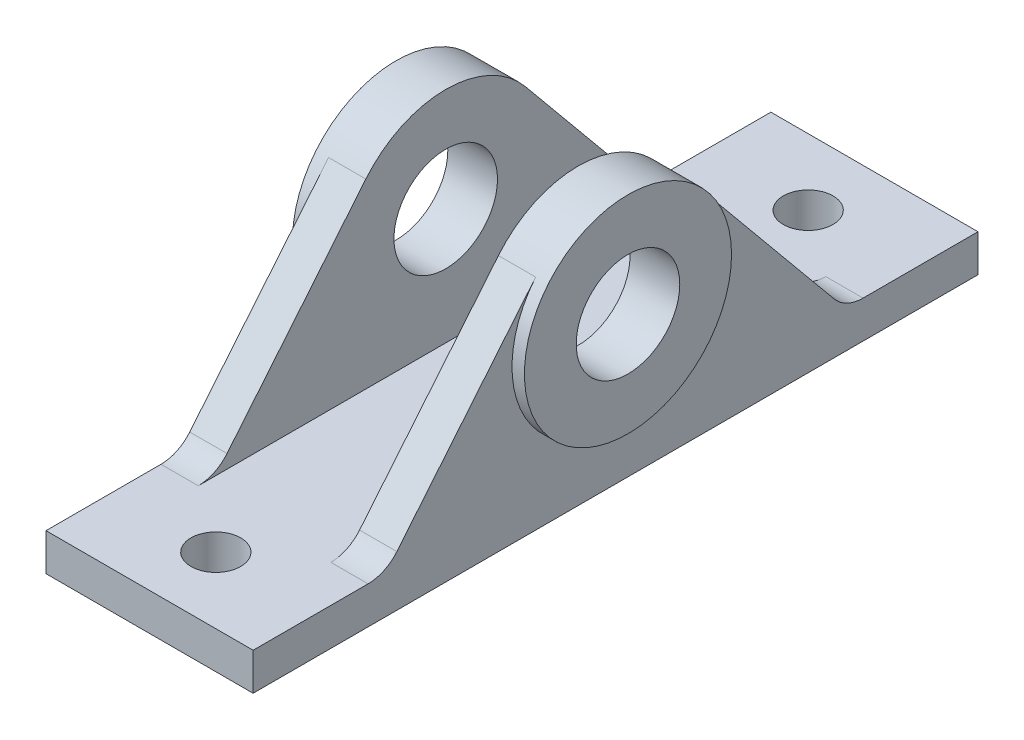
ISO-10303-21;
HEADER;
FILE_DESCRIPTION(('STEP AP214'),'2;1');
FILE_NAME('part.step','',(''),(''),'','','');
FILE_SCHEMA(('AUTOMOTIVE_DESIGN { 1 0 10303 214 1 1 1 1 }'));
ENDSEC;
DATA;
#1=APPLICATION_CONTEXT('core data for automotive mechanical design processes');
#2=APPLICATION_PROTOCOL_DEFINITION('international standard','automotive_design',2000,#1);
#3=PRODUCT_CONTEXT('',#1,'mechanical');
#4=PRODUCT('Part','Part','',(#3));
#5=PRODUCT_RELATED_PRODUCT_CATEGORY('part','',(#4));
#6=PRODUCT_DEFINITION_FORMATION('','',#4);
#7=PRODUCT_DEFINITION_CONTEXT('part definition',#1,'design');
#8=PRODUCT_DEFINITION('design','',#6,#7);
#9=PRODUCT_DEFINITION_SHAPE('','',#8);
#10=(LENGTH_UNIT() NAMED_UNIT(*) SI_UNIT(.MILLI.,.METRE.));
#11=(NAMED_UNIT(*) PLANE_ANGLE_UNIT() SI_UNIT($,.RADIAN.));
#12=(NAMED_UNIT(*) SI_UNIT($,.STERADIAN.) SOLID_ANGLE_UNIT());
#13=UNCERTAINTY_MEASURE_WITH_UNIT(LENGTH_MEASURE(1.E-05),#10,'distance_accuracy_value','');
#14=(GEOMETRIC_REPRESENTATION_CONTEXT(3) GLOBAL_UNCERTAINTY_ASSIGNED_CONTEXT((#13)) GLOBAL_UNIT_ASSIGNED_CONTEXT((#10,
#11,#12)) REPRESENTATION_CONTEXT('',''));
#15=CARTESIAN_POINT('',(0.,0.,0.));
#16=DIRECTION('',(0.,0.,1.));
#17=DIRECTION('',(1.,0.,0.));
#18=AXIS2_PLACEMENT_3D('',#15,#16,#17);
#19=CARTESIAN_POINT('',(0.,9.,0.));
#20=DIRECTION('',(0.,-1.,0.));
#21=DIRECTION('',(0.,0.,-1.));
#22=AXIS2_PLACEMENT_3D('',#19,#20,#21);
#23=PLANE('',#22);
#24=CARTESIAN_POINT('',(0.,9.,-71.5));
#25=DIRECTION('',(0.,-1.,0.));
#26=DIRECTION('',(0.,0.,-1.));
#27=AXIS2_PLACEMENT_3D('',#24,#25,#26);
#28=CIRCLE('',#27,6.);
#29=CARTESIAN_POINT('',(0.,9.,-77.5));
#30=VERTEX_POINT('',#29);
#31=EDGE_CURVE('E245',#30,#30,#28,.T.);
#32=ORIENTED_EDGE('',*,*,#31,.T.);
#33=EDGE_LOOP('',(#32));
#34=FACE_BOUND('',#33,.T.);
#35=CARTESIAN_POINT('',(0.,9.,71.5));
#36=DIRECTION('',(0.,1.,0.));
#37=DIRECTION('',(0.,0.,1.));
#38=AXIS2_PLACEMENT_3D('',#35,#36,#37);
#39=CIRCLE('',#38,6.);
#40=CARTESIAN_POINT('',(0.,9.,77.5));
#41=VERTEX_POINT('',#40);
#42=EDGE_CURVE('E253',#41,#41,#39,.T.);
#43=ORIENTED_EDGE('',*,*,#42,.F.);
#44=EDGE_LOOP('',(#43));
#45=FACE_BOUND('',#44,.T.);
#46=DIRECTION('',(0.,0.,1.));
#47=VECTOR('',#46,1.);
#48=CARTESIAN_POINT('',(-25.,9.,87.5));
#49=LINE('',#48,#47);
#50=CARTESIAN_POINT('',(-25.,9.,-87.5));
#51=VERTEX_POINT('',#50);
#52=CARTESIAN_POINT('',(-25.,9.,-59.7432282698204));
#53=VERTEX_POINT('',#52);
#54=EDGE_CURVE('E274',#51,#53,#49,.T.);
#55=ORIENTED_EDGE('',*,*,#54,.T.);
#56=DIRECTION('',(-1.,0.,0.));
#57=VECTOR('',#56,1.);
#58=CARTESIAN_POINT('',(-16.,9.,-59.7432282698204));
#59=LINE('',#58,#57);
#60=CARTESIAN_POINT('',(-16.,9.,-59.7432282698204));
#61=VERTEX_POINT('',#60);
#62=EDGE_CURVE('E344',#53,#61,#59,.F.);
#63=ORIENTED_EDGE('',*,*,#62,.T.);
#64=DIRECTION('',(0.,0.,1.));
#65=VECTOR('',#64,1.);
#66=CARTESIAN_POINT('',(-16.,9.,0.));
#67=LINE('',#66,#65);
#68=CARTESIAN_POINT('',(-16.,9.,59.7432282698204));
#69=VERTEX_POINT('',#68);
#70=EDGE_CURVE('E195',#61,#69,#67,.T.);
#71=ORIENTED_EDGE('',*,*,#70,.T.);
#72=DIRECTION('',(-1.,0.,0.));
#73=VECTOR('',#72,1.);
#74=CARTESIAN_POINT('',(0.,9.,59.7432282698204));
#75=LINE('',#74,#73);
#76=CARTESIAN_POINT('',(-25.,9.,59.7432282698204));
#77=VERTEX_POINT('',#76);
#78=EDGE_CURVE('E340',#69,#77,#75,.T.);
#79=ORIENTED_EDGE('',*,*,#78,.T.);
#80=CARTESIAN_POINT('',(-25.,9.,87.5));
#81=VERTEX_POINT('',#80);
#82=EDGE_CURVE('E273',#77,#81,#49,.T.);
#83=ORIENTED_EDGE('',*,*,#82,.T.);
#84=DIRECTION('',(1.,0.,0.));
#85=VECTOR('',#84,1.);
#86=CARTESIAN_POINT('',(-25.,9.,87.5));
#87=LINE('',#86,#85);
#88=CARTESIAN_POINT('',(25.,9.,87.5));
#89=VERTEX_POINT('',#88);
#90=EDGE_CURVE('E278',#81,#89,#87,.T.);
#91=ORIENTED_EDGE('',*,*,#90,.T.);
#92=DIRECTION('',(0.,0.,-1.));
#93=VECTOR('',#92,1.);
#94=CARTESIAN_POINT('',(25.,9.,87.5));
#95=LINE('',#94,#93);
#96=CARTESIAN_POINT('',(25.,9.,59.7432282698204));
#97=VERTEX_POINT('',#96);
#98=EDGE_CURVE('E265',#89,#97,#95,.T.);
#99=ORIENTED_EDGE('',*,*,#98,.T.);
#100=DIRECTION('',(1.,0.,0.));
#101=VECTOR('',#100,1.);
#102=CARTESIAN_POINT('',(16.,9.,59.7432282698204));
#103=LINE('',#102,#101);
#104=CARTESIAN_POINT('',(16.,9.,59.7432282698204));
#105=VERTEX_POINT('',#104);
#106=EDGE_CURVE('E309',#97,#105,#103,.F.);
#107=ORIENTED_EDGE('',*,*,#106,.T.);
#108=DIRECTION('',(0.,0.,1.));
#109=VECTOR('',#108,1.);
#110=CARTESIAN_POINT('',(16.,9.,0.));
#111=LINE('',#110,#109);
#112=CARTESIAN_POINT('',(16.,9.,-59.7432282698204));
#113=VERTEX_POINT('',#112);
#114=EDGE_CURVE('E222',#113,#105,#111,.T.);
#115=ORIENTED_EDGE('',*,*,#114,.F.);
#116=DIRECTION('',(1.,0.,0.));
#117=VECTOR('',#116,1.);
#118=CARTESIAN_POINT('',(0.,9.,-59.7432282698204));
#119=LINE('',#118,#117);
#120=CARTESIAN_POINT('',(25.,9.,-59.7432282698204));
#121=VERTEX_POINT('',#120);
#122=EDGE_CURVE('E313',#113,#121,#119,.T.);
#123=ORIENTED_EDGE('',*,*,#122,.T.);
#124=CARTESIAN_POINT('',(25.,9.,-87.5));
#125=VERTEX_POINT('',#124);
#126=EDGE_CURVE('E270',#121,#125,#95,.T.);
#127=ORIENTED_EDGE('',*,*,#126,.T.);
#128=DIRECTION('',(-1.,0.,0.));
#129=VECTOR('',#128,1.);
#130=CARTESIAN_POINT('',(-25.,9.,-87.5));
#131=LINE('',#130,#129);
#132=EDGE_CURVE('E269',#125,#51,#131,.T.);
#133=ORIENTED_EDGE('',*,*,#132,.T.);
#134=EDGE_LOOP('',(#55,#63,#71,#79,#83,#91,#99,#107,#115,#123,#127,#133));
#135=FACE_BOUND('',#134,.T.);
#136=ADVANCED_FACE('F39',(#34,#45,#135),#23,.F.);
#137=CARTESIAN_POINT('',(25.,9.,87.5));
#138=DIRECTION('',(-1.,0.,0.));
#139=DIRECTION('',(0.,0.,1.));
#140=AXIS2_PLACEMENT_3D('',#137,#138,#139);
#141=PLANE('',#140);
#142=DIRECTION('',(0.,0.,-1.));
#143=VECTOR('',#142,1.);
#144=CARTESIAN_POINT('',(25.,0.,87.5));
#145=LINE('',#144,#143);
#146=CARTESIAN_POINT('',(25.,0.,87.5));
#147=VERTEX_POINT('',#146);
#148=CARTESIAN_POINT('',(25.,0.,-87.5));
#149=VERTEX_POINT('',#148);
#150=EDGE_CURVE('E261',#147,#149,#145,.T.);
#151=ORIENTED_EDGE('',*,*,#150,.T.);
#152=DIRECTION('',(0.,-1.,0.));
#153=VECTOR('',#152,1.);
#154=CARTESIAN_POINT('',(25.,9.,-87.5));
#155=LINE('',#154,#153);
#156=EDGE_CURVE('E305',#125,#149,#155,.T.);
#157=ORIENTED_EDGE('',*,*,#156,.F.);
#158=ORIENTED_EDGE('',*,*,#126,.F.);
#159=CARTESIAN_POINT('',(25.,18.,-59.7432282698204));
#160=DIRECTION('',(-1.,0.,0.));
#161=DIRECTION('',(0.,0.,1.));
#162=AXIS2_PLACEMENT_3D('',#159,#160,#161);
#163=CIRCLE('',#162,9.);
#164=CARTESIAN_POINT('',(25.,12.2734689766643,-52.8001135193087));
#165=VERTEX_POINT('',#164);
#166=EDGE_CURVE('E324',#121,#165,#163,.T.);
#167=ORIENTED_EDGE('',*,*,#166,.T.);
#168=DIRECTION('',(0.,0.771457194501302,0.636281224815081));
#169=VECTOR('',#168,1.);
#170=CARTESIAN_POINT('',(25.,30.8866211113077,-37.4483878210913));
#171=LINE('',#170,#169);
#172=CARTESIAN_POINT('',(25.,52.907030620377,-19.2864298625326));
#173=VERTEX_POINT('',#172);
#174=EDGE_CURVE('E221',#165,#173,#171,.T.);
#175=ORIENTED_EDGE('',*,*,#174,.T.);
#176=CARTESIAN_POINT('',(25.,37.,0.));
#177=DIRECTION('',(1.,0.,0.));
#178=DIRECTION('',(0.,0.,-1.));
#179=AXIS2_PLACEMENT_3D('',#176,#177,#178);
#180=CIRCLE('',#179,25.);
#181=CARTESIAN_POINT('',(25.,52.907030620377,19.2864298625326));
#182=VERTEX_POINT('',#181);
#183=EDGE_CURVE('E235',#182,#173,#180,.T.);
#184=ORIENTED_EDGE('',*,*,#183,.F.);
#185=DIRECTION('',(0.,0.771457194501302,-0.636281224815081));
#186=VECTOR('',#185,1.);
#187=CARTESIAN_POINT('',(25.,30.8866211113077,37.4483878210913));
#188=LINE('',#187,#186);
#189=CARTESIAN_POINT('',(25.,12.2734689766643,52.8001135193087));
#190=VERTEX_POINT('',#189);
#191=EDGE_CURVE('E226',#190,#182,#188,.T.);
#192=ORIENTED_EDGE('',*,*,#191,.F.);
#193=CARTESIAN_POINT('',(25.,18.,59.7432282698204));
#194=DIRECTION('',(-1.,0.,0.));
#195=DIRECTION('',(0.,0.,1.));
#196=AXIS2_PLACEMENT_3D('',#193,#194,#195);
#197=CIRCLE('',#196,9.);
#198=EDGE_CURVE('E331',#190,#97,#197,.T.);
#199=ORIENTED_EDGE('',*,*,#198,.T.);
#200=ORIENTED_EDGE('',*,*,#98,.F.);
#201=DIRECTION('',(0.,-1.,0.));
#202=VECTOR('',#201,1.);
#203=CARTESIAN_POINT('',(25.,9.,87.5));
#204=LINE('',#203,#202);
#205=EDGE_CURVE('E281',#89,#147,#204,.T.);
#206=ORIENTED_EDGE('',*,*,#205,.T.);
#207=EDGE_LOOP('',(#151,#157,#158,#167,#175,#184,#192,#199,#200,#206));
#208=FACE_BOUND('',#207,.T.);
#209=ADVANCED_FACE('F367',(#208),#141,.F.);
#210=CARTESIAN_POINT('',(-25.,9.,-87.5));
#211=DIRECTION('',(0.,0.,1.));
#212=DIRECTION('',(1.,0.,0.));
#213=AXIS2_PLACEMENT_3D('',#210,#211,#212);
#214=PLANE('',#213);
#215=DIRECTION('',(-1.,0.,0.));
#216=VECTOR('',#215,1.);
#217=CARTESIAN_POINT('',(-25.,0.,-87.5));
#218=LINE('',#217,#216);
#219=CARTESIAN_POINT('',(-25.,0.,-87.5));
#220=VERTEX_POINT('',#219);
#221=EDGE_CURVE('E285',#149,#220,#218,.T.);
#222=ORIENTED_EDGE('',*,*,#221,.T.);
#223=DIRECTION('',(0.,-1.,0.));
#224=VECTOR('',#223,1.);
#225=CARTESIAN_POINT('',(-25.,9.,-87.5));
#226=LINE('',#225,#224);
#227=EDGE_CURVE('E301',#51,#220,#226,.T.);
#228=ORIENTED_EDGE('',*,*,#227,.F.);
#229=ORIENTED_EDGE('',*,*,#132,.F.);
#230=ORIENTED_EDGE('',*,*,#156,.T.);
#231=EDGE_LOOP('',(#222,#228,#229,#230));
#232=FACE_BOUND('',#231,.T.);
#233=ADVANCED_FACE('F365',(#232),#214,.F.);
#234=CARTESIAN_POINT('',(-25.,9.,87.5));
#235=DIRECTION('',(1.,0.,0.));
#236=DIRECTION('',(0.,0.,-1.));
#237=AXIS2_PLACEMENT_3D('',#234,#235,#236);
#238=PLANE('',#237);
#239=DIRECTION('',(0.,0.,1.));
#240=VECTOR('',#239,1.);
#241=CARTESIAN_POINT('',(-25.,0.,87.5));
#242=LINE('',#241,#240);
#243=CARTESIAN_POINT('',(-25.,0.,87.5));
#244=VERTEX_POINT('',#243);
#245=EDGE_CURVE('E288',#220,#244,#242,.T.);
#246=ORIENTED_EDGE('',*,*,#245,.T.);
#247=DIRECTION('',(0.,-1.,0.));
#248=VECTOR('',#247,1.);
#249=CARTESIAN_POINT('',(-25.,9.,87.5));
#250=LINE('',#249,#248);
#251=EDGE_CURVE('E297',#81,#244,#250,.T.);
#252=ORIENTED_EDGE('',*,*,#251,.F.);
#253=ORIENTED_EDGE('',*,*,#82,.F.);
#254=CARTESIAN_POINT('',(-25.,18.,59.7432282698204));
#255=DIRECTION('',(1.,0.,0.));
#256=DIRECTION('',(0.,0.,-1.));
#257=AXIS2_PLACEMENT_3D('',#254,#255,#256);
#258=CIRCLE('',#257,9.);
#259=CARTESIAN_POINT('',(-25.,12.2734689766643,52.8001135193087));
#260=VERTEX_POINT('',#259);
#261=EDGE_CURVE('E48',#77,#260,#258,.T.);
#262=ORIENTED_EDGE('',*,*,#261,.T.);
#263=DIRECTION('',(0.,0.771457194501302,-0.636281224815081));
#264=VECTOR('',#263,1.);
#265=CARTESIAN_POINT('',(-25.,30.8866211113077,37.4483878210913));
#266=LINE('',#265,#264);
#267=CARTESIAN_POINT('',(-25.,52.907030620377,19.2864298625326));
#268=VERTEX_POINT('',#267);
#269=EDGE_CURVE('E183',#260,#268,#266,.T.);
#270=ORIENTED_EDGE('',*,*,#269,.T.);
#271=CARTESIAN_POINT('',(-25.,37.,0.));
#272=DIRECTION('',(1.,0.,0.));
#273=DIRECTION('',(0.,0.,-1.));
#274=AXIS2_PLACEMENT_3D('',#271,#272,#273);
#275=CIRCLE('',#274,25.);
#276=CARTESIAN_POINT('',(-25.,52.907030620377,-19.2864298625326));
#277=VERTEX_POINT('',#276);
#278=EDGE_CURVE('E188',#268,#277,#275,.T.);
#279=ORIENTED_EDGE('',*,*,#278,.T.);
#280=DIRECTION('',(0.,0.771457194501302,0.636281224815081));
#281=VECTOR('',#280,1.);
#282=CARTESIAN_POINT('',(-25.,30.8866211113077,-37.4483878210913));
#283=LINE('',#282,#281);
#284=CARTESIAN_POINT('',(-25.,12.2734689766643,-52.8001135193087));
#285=VERTEX_POINT('',#284);
#286=EDGE_CURVE('E171',#285,#277,#283,.T.);
#287=ORIENTED_EDGE('',*,*,#286,.F.);
#288=CARTESIAN_POINT('',(-25.,18.,-59.7432282698204));
#289=DIRECTION('',(1.,0.,0.));
#290=DIRECTION('',(0.,0.,-1.));
#291=AXIS2_PLACEMENT_3D('',#288,#289,#290);
#292=CIRCLE('',#291,9.);
#293=EDGE_CURVE('E350',#285,#53,#292,.T.);
#294=ORIENTED_EDGE('',*,*,#293,.T.);
#295=ORIENTED_EDGE('',*,*,#54,.F.);
#296=ORIENTED_EDGE('',*,*,#227,.T.);
#297=EDGE_LOOP('',(#246,#252,#253,#262,#270,#279,#287,#294,#295,#296));
#298=FACE_BOUND('',#297,.T.);
#299=ADVANCED_FACE('F375',(#298),#238,.F.);
#300=CARTESIAN_POINT('',(-25.,9.,87.5));
#301=DIRECTION('',(0.,0.,-1.));
#302=DIRECTION('',(-1.,0.,0.));
#303=AXIS2_PLACEMENT_3D('',#300,#301,#302);
#304=PLANE('',#303);
#305=DIRECTION('',(1.,0.,0.));
#306=VECTOR('',#305,1.);
#307=CARTESIAN_POINT('',(-25.,0.,87.5));
#308=LINE('',#307,#306);
#309=EDGE_CURVE('E291',#244,#147,#308,.T.);
#310=ORIENTED_EDGE('',*,*,#309,.T.);
#311=ORIENTED_EDGE('',*,*,#205,.F.);
#312=ORIENTED_EDGE('',*,*,#90,.F.);
#313=ORIENTED_EDGE('',*,*,#251,.T.);
#314=EDGE_LOOP('',(#310,#311,#312,#313));
#315=FACE_BOUND('',#314,.T.);
#316=ADVANCED_FACE('F386',(#315),#304,.F.);
#317=CARTESIAN_POINT('',(0.,0.,0.));
#318=DIRECTION('',(0.,-1.,0.));
#319=DIRECTION('',(0.,0.,-1.));
#320=AXIS2_PLACEMENT_3D('',#317,#318,#319);
#321=PLANE('',#320);
#322=CARTESIAN_POINT('',(0.,0.,-71.5));
#323=DIRECTION('',(0.,-1.,0.));
#324=DIRECTION('',(0.,0.,-1.));
#325=AXIS2_PLACEMENT_3D('',#322,#323,#324);
#326=CIRCLE('',#325,6.);
#327=CARTESIAN_POINT('',(0.,0.,-77.5));
#328=VERTEX_POINT('',#327);
#329=EDGE_CURVE('E249',#328,#328,#326,.T.);
#330=ORIENTED_EDGE('',*,*,#329,.F.);
#331=EDGE_LOOP('',(#330));
#332=FACE_BOUND('',#331,.T.);
#333=CARTESIAN_POINT('',(0.,0.,71.5));
#334=DIRECTION('',(0.,1.,0.));
#335=DIRECTION('',(0.,0.,1.));
#336=AXIS2_PLACEMENT_3D('',#333,#334,#335);
#337=CIRCLE('',#336,6.);
#338=CARTESIAN_POINT('',(0.,0.,77.5));
#339=VERTEX_POINT('',#338);
#340=EDGE_CURVE('E257',#339,#339,#337,.T.);
#341=ORIENTED_EDGE('',*,*,#340,.T.);
#342=EDGE_LOOP('',(#341));
#343=FACE_BOUND('',#342,.T.);
#344=ORIENTED_EDGE('',*,*,#150,.F.);
#345=ORIENTED_EDGE('',*,*,#309,.F.);
#346=ORIENTED_EDGE('',*,*,#245,.F.);
#347=ORIENTED_EDGE('',*,*,#221,.F.);
#348=EDGE_LOOP('',(#344,#345,#346,#347));
#349=FACE_BOUND('',#348,.T.);
#350=ADVANCED_FACE('F373',(#332,#343,#349),#321,.T.);
#351=CARTESIAN_POINT('',(0.,0.,71.5));
#352=DIRECTION('',(0.,1.,0.));
#353=DIRECTION('',(0.,0.,1.));
#354=AXIS2_PLACEMENT_3D('',#351,#352,#353);
#355=CYLINDRICAL_SURFACE('',#354,6.);
#356=ORIENTED_EDGE('',*,*,#340,.F.);
#357=EDGE_LOOP('',(#356));
#358=FACE_BOUND('',#357,.T.);
#359=ORIENTED_EDGE('',*,*,#42,.T.);
#360=EDGE_LOOP('',(#359));
#361=FACE_BOUND('',#360,.T.);
#362=ADVANCED_FACE('F434',(#358,#361),#355,.F.);
#363=CARTESIAN_POINT('',(0.,0.,-71.5));
#364=DIRECTION('',(0.,1.,0.));
#365=DIRECTION('',(0.,0.,1.));
#366=AXIS2_PLACEMENT_3D('',#363,#364,#365);
#367=CYLINDRICAL_SURFACE('',#366,6.);
#368=ORIENTED_EDGE('',*,*,#329,.T.);
#369=EDGE_LOOP('',(#368));
#370=FACE_BOUND('',#369,.T.);
#371=ORIENTED_EDGE('',*,*,#31,.F.);
#372=EDGE_LOOP('',(#371));
#373=FACE_BOUND('',#372,.T.);
#374=ADVANCED_FACE('F468',(#370,#373),#367,.F.);
#375=CARTESIAN_POINT('',(16.,30.8866211113077,37.4483878210913));
#376=DIRECTION('',(0.,-0.636281224815081,-0.771457194501302));
#377=DIRECTION('',(0.,0.771457194501302,-0.636281224815081));
#378=AXIS2_PLACEMENT_3D('',#375,#376,#377);
#379=PLANE('',#378);
#380=DIRECTION('',(0.,0.771457194501302,-0.636281224815081));
#381=VECTOR('',#380,1.);
#382=CARTESIAN_POINT('',(16.,30.8866211113077,37.4483878210913));
#383=LINE('',#382,#381);
#384=CARTESIAN_POINT('',(16.,12.2734689766643,52.8001135193087));
#385=VERTEX_POINT('',#384);
#386=CARTESIAN_POINT('',(16.,52.907030620377,19.2864298625326));
#387=VERTEX_POINT('',#386);
#388=EDGE_CURVE('E229',#385,#387,#383,.T.);
#389=ORIENTED_EDGE('',*,*,#388,.F.);
#390=DIRECTION('',(1.,0.,0.));
#391=VECTOR('',#390,1.);
#392=CARTESIAN_POINT('',(25.,12.2734689766643,52.8001135193087));
#393=LINE('',#392,#391);
#394=EDGE_CURVE('E320',#385,#190,#393,.T.);
#395=ORIENTED_EDGE('',*,*,#394,.T.);
#396=ORIENTED_EDGE('',*,*,#191,.T.);
#397=DIRECTION('',(1.,0.,0.));
#398=VECTOR('',#397,1.);
#399=CARTESIAN_POINT('',(16.,52.907030620377,19.2864298625326));
#400=LINE('',#399,#398);
#401=EDGE_CURVE('E241',#387,#182,#400,.T.);
#402=ORIENTED_EDGE('',*,*,#401,.F.);
#403=EDGE_LOOP('',(#389,#395,#396,#402));
#404=FACE_BOUND('',#403,.T.);
#405=ADVANCED_FACE('F399',(#404),#379,.F.);
#406=CARTESIAN_POINT('',(16.,30.8866211113077,-37.4483878210913));
#407=DIRECTION('',(0.,0.636281224815081,-0.771457194501302));
#408=DIRECTION('',(0.,0.771457194501302,0.636281224815081));
#409=AXIS2_PLACEMENT_3D('',#406,#407,#408);
#410=PLANE('',#409);
#411=ORIENTED_EDGE('',*,*,#174,.F.);
#412=DIRECTION('',(1.,0.,0.));
#413=VECTOR('',#412,1.);
#414=CARTESIAN_POINT('',(16.,12.2734689766643,-52.8001135193087));
#415=LINE('',#414,#413);
#416=CARTESIAN_POINT('',(16.,12.2734689766643,-52.8001135193087));
#417=VERTEX_POINT('',#416);
#418=EDGE_CURVE('E317',#165,#417,#415,.F.);
#419=ORIENTED_EDGE('',*,*,#418,.T.);
#420=DIRECTION('',(0.,0.771457194501302,0.636281224815081));
#421=VECTOR('',#420,1.);
#422=CARTESIAN_POINT('',(16.,30.8866211113077,-37.4483878210913));
#423=LINE('',#422,#421);
#424=CARTESIAN_POINT('',(16.,52.907030620377,-19.2864298625326));
#425=VERTEX_POINT('',#424);
#426=EDGE_CURVE('E225',#417,#425,#423,.T.);
#427=ORIENTED_EDGE('',*,*,#426,.T.);
#428=DIRECTION('',(1.,0.,0.));
#429=VECTOR('',#428,1.);
#430=CARTESIAN_POINT('',(16.,52.907030620377,-19.2864298625326));
#431=LINE('',#430,#429);
#432=EDGE_CURVE('E232',#425,#173,#431,.T.);
#433=ORIENTED_EDGE('',*,*,#432,.T.);
#434=EDGE_LOOP('',(#411,#419,#427,#433));
#435=FACE_BOUND('',#434,.T.);
#436=ADVANCED_FACE('F409',(#435),#410,.T.);
#437=CARTESIAN_POINT('',(16.,0.,0.));
#438=DIRECTION('',(1.,0.,0.));
#439=DIRECTION('',(0.,0.,-1.));
#440=AXIS2_PLACEMENT_3D('',#437,#438,#439);
#441=PLANE('',#440);
#442=ORIENTED_EDGE('',*,*,#114,.T.);
#443=CARTESIAN_POINT('',(16.,18.,59.7432282698204));
#444=DIRECTION('',(1.,0.,0.));
#445=DIRECTION('',(0.,0.,-1.));
#446=AXIS2_PLACEMENT_3D('',#443,#444,#445);
#447=CIRCLE('',#446,9.);
#448=EDGE_CURVE('E334',#105,#385,#447,.T.);
#449=ORIENTED_EDGE('',*,*,#448,.T.);
#450=ORIENTED_EDGE('',*,*,#388,.T.);
#451=CARTESIAN_POINT('',(16.,37.,0.));
#452=DIRECTION('',(1.,0.,0.));
#453=DIRECTION('',(0.,0.,-1.));
#454=AXIS2_PLACEMENT_3D('',#451,#452,#453);
#455=CIRCLE('',#454,25.);
#456=EDGE_CURVE('E217',#425,#387,#455,.T.);
#457=ORIENTED_EDGE('',*,*,#456,.F.);
#458=ORIENTED_EDGE('',*,*,#426,.F.);
#459=CARTESIAN_POINT('',(16.,18.,-59.7432282698204));
#460=DIRECTION('',(1.,0.,0.));
#461=DIRECTION('',(0.,0.,-1.));
#462=AXIS2_PLACEMENT_3D('',#459,#460,#461);
#463=CIRCLE('',#462,9.);
#464=EDGE_CURVE('E327',#417,#113,#463,.T.);
#465=ORIENTED_EDGE('',*,*,#464,.T.);
#466=EDGE_LOOP('',(#442,#449,#450,#457,#458,#465));
#467=FACE_BOUND('',#466,.T.);
#468=CARTESIAN_POINT('',(16.,37.,0.));
#469=DIRECTION('',(1.,0.,0.));
#470=DIRECTION('',(0.,0.,-1.));
#471=AXIS2_PLACEMENT_3D('',#468,#469,#470);
#472=CIRCLE('',#471,12.5);
#473=CARTESIAN_POINT('',(16.,37.,-12.5));
#474=VERTEX_POINT('',#473);
#475=EDGE_CURVE('E213',#474,#474,#472,.T.);
#476=ORIENTED_EDGE('',*,*,#475,.T.);
#477=EDGE_LOOP('',(#476));
#478=FACE_BOUND('',#477,.T.);
#479=ADVANCED_FACE('F394',(#467,#478),#441,.F.);
#480=CARTESIAN_POINT('',(16.,37.,0.));
#481=DIRECTION('',(1.,0.,0.));
#482=DIRECTION('',(0.,0.,-1.));
#483=AXIS2_PLACEMENT_3D('',#480,#481,#482);
#484=CYLINDRICAL_SURFACE('',#483,12.5);
#485=ORIENTED_EDGE('',*,*,#475,.F.);
#486=EDGE_LOOP('',(#485));
#487=FACE_BOUND('',#486,.T.);
#488=CARTESIAN_POINT('',(28.,37.,0.));
#489=DIRECTION('',(1.,0.,0.));
#490=DIRECTION('',(0.,0.,-1.));
#491=AXIS2_PLACEMENT_3D('',#488,#489,#490);
#492=CIRCLE('',#491,12.5);
#493=CARTESIAN_POINT('',(28.,37.,-12.5));
#494=VERTEX_POINT('',#493);
#495=EDGE_CURVE('E176',#494,#494,#492,.T.);
#496=ORIENTED_EDGE('',*,*,#495,.T.);
#497=EDGE_LOOP('',(#496));
#498=FACE_BOUND('',#497,.T.);
#499=ADVANCED_FACE('F493',(#487,#498),#484,.F.);
#500=CARTESIAN_POINT('',(16.,37.,0.));
#501=DIRECTION('',(1.,0.,0.));
#502=DIRECTION('',(0.,0.,-1.));
#503=AXIS2_PLACEMENT_3D('',#500,#501,#502);
#504=CYLINDRICAL_SURFACE('',#503,25.);
#505=ORIENTED_EDGE('',*,*,#456,.T.);
#506=ORIENTED_EDGE('',*,*,#401,.T.);
#507=ORIENTED_EDGE('',*,*,#183,.T.);
#508=ORIENTED_EDGE('',*,*,#432,.F.);
#509=EDGE_LOOP('',(#505,#506,#507,#508));
#510=FACE_BOUND('',#509,.T.);
#511=CARTESIAN_POINT('',(28.,37.,0.));
#512=DIRECTION('',(1.,0.,0.));
#513=DIRECTION('',(0.,0.,-1.));
#514=AXIS2_PLACEMENT_3D('',#511,#512,#513);
#515=CIRCLE('',#514,25.);
#516=CARTESIAN_POINT('',(28.,37.,-25.));
#517=VERTEX_POINT('',#516);
#518=EDGE_CURVE('E209',#517,#517,#515,.T.);
#519=ORIENTED_EDGE('',*,*,#518,.F.);
#520=EDGE_LOOP('',(#519));
#521=FACE_BOUND('',#520,.T.);
#522=ADVANCED_FACE('F403',(#510,#521),#504,.T.);
#523=CARTESIAN_POINT('',(28.,0.,0.));
#524=DIRECTION('',(1.,0.,0.));
#525=DIRECTION('',(0.,0.,-1.));
#526=AXIS2_PLACEMENT_3D('',#523,#524,#525);
#527=PLANE('',#526);
#528=ORIENTED_EDGE('',*,*,#495,.F.);
#529=EDGE_LOOP('',(#528));
#530=FACE_BOUND('',#529,.T.);
#531=ORIENTED_EDGE('',*,*,#518,.T.);
#532=EDGE_LOOP('',(#531));
#533=FACE_BOUND('',#532,.T.);
#534=ADVANCED_FACE('F415',(#530,#533),#527,.T.);
#535=CARTESIAN_POINT('',(0.,18.,-59.7432282698204));
#536=DIRECTION('',(1.,0.,0.));
#537=DIRECTION('',(0.,0.,-1.));
#538=AXIS2_PLACEMENT_3D('',#535,#536,#537);
#539=CYLINDRICAL_SURFACE('',#538,9.);
#540=ORIENTED_EDGE('',*,*,#464,.F.);
#541=ORIENTED_EDGE('',*,*,#418,.F.);
#542=ORIENTED_EDGE('',*,*,#166,.F.);
#543=ORIENTED_EDGE('',*,*,#122,.F.);
#544=EDGE_LOOP('',(#540,#541,#542,#543));
#545=FACE_BOUND('',#544,.T.);
#546=ADVANCED_FACE('F413',(#545),#539,.F.);
#547=CARTESIAN_POINT('',(16.,18.,59.7432282698204));
#548=DIRECTION('',(-1.,0.,0.));
#549=DIRECTION('',(0.,0.,1.));
#550=AXIS2_PLACEMENT_3D('',#547,#548,#549);
#551=CYLINDRICAL_SURFACE('',#550,9.);
#552=ORIENTED_EDGE('',*,*,#448,.F.);
#553=ORIENTED_EDGE('',*,*,#106,.F.);
#554=ORIENTED_EDGE('',*,*,#198,.F.);
#555=ORIENTED_EDGE('',*,*,#394,.F.);
#556=EDGE_LOOP('',(#552,#553,#554,#555));
#557=FACE_BOUND('',#556,.T.);
#558=ADVANCED_FACE('F390',(#557),#551,.F.);
#559=CARTESIAN_POINT('',(-16.,30.8866211113077,-37.4483878210913));
#560=DIRECTION('',(0.,-0.636281224815081,0.771457194501302));
#561=DIRECTION('',(0.,-0.771457194501302,-0.636281224815081));
#562=AXIS2_PLACEMENT_3D('',#559,#560,#561);
#563=PLANE('',#562);
#564=DIRECTION('',(0.,0.771457194501302,0.636281224815081));
#565=VECTOR('',#564,1.);
#566=CARTESIAN_POINT('',(-16.,30.8866211113077,-37.4483878210913));
#567=LINE('',#566,#565);
#568=CARTESIAN_POINT('',(-16.,12.2734689766643,-52.8001135193087));
#569=VERTEX_POINT('',#568);
#570=CARTESIAN_POINT('',(-16.,52.907030620377,-19.2864298625326));
#571=VERTEX_POINT('',#570);
#572=EDGE_CURVE('E152',#569,#571,#567,.T.);
#573=ORIENTED_EDGE('',*,*,#572,.F.);
#574=DIRECTION('',(-1.,0.,0.));
#575=VECTOR('',#574,1.);
#576=CARTESIAN_POINT('',(-25.,12.2734689766643,-52.8001135193087));
#577=LINE('',#576,#575);
#578=EDGE_CURVE('E337',#569,#285,#577,.T.);
#579=ORIENTED_EDGE('',*,*,#578,.T.);
#580=ORIENTED_EDGE('',*,*,#286,.T.);
#581=DIRECTION('',(-1.,0.,0.));
#582=VECTOR('',#581,1.);
#583=CARTESIAN_POINT('',(-16.,52.907030620377,-19.2864298625326));
#584=LINE('',#583,#582);
#585=EDGE_CURVE('E168',#571,#277,#584,.T.);
#586=ORIENTED_EDGE('',*,*,#585,.F.);
#587=EDGE_LOOP('',(#573,#579,#580,#586));
#588=FACE_BOUND('',#587,.T.);
#589=ADVANCED_FACE('F169',(#588),#563,.F.);
#590=CARTESIAN_POINT('',(-16.,30.8866211113077,37.4483878210913));
#591=DIRECTION('',(0.,0.636281224815081,0.771457194501302));
#592=DIRECTION('',(0.,-0.771457194501302,0.636281224815081));
#593=AXIS2_PLACEMENT_3D('',#590,#591,#592);
#594=PLANE('',#593);
#595=ORIENTED_EDGE('',*,*,#269,.F.);
#596=DIRECTION('',(-1.,0.,0.));
#597=VECTOR('',#596,1.);
#598=CARTESIAN_POINT('',(-16.,12.2734689766643,52.8001135193087));
#599=LINE('',#598,#597);
#600=CARTESIAN_POINT('',(-16.,12.2734689766643,52.8001135193087));
#601=VERTEX_POINT('',#600);
#602=EDGE_CURVE('E55',#260,#601,#599,.F.);
#603=ORIENTED_EDGE('',*,*,#602,.T.);
#604=DIRECTION('',(0.,0.771457194501302,-0.636281224815081));
#605=VECTOR('',#604,1.);
#606=CARTESIAN_POINT('',(-16.,30.8866211113077,37.4483878210913));
#607=LINE('',#606,#605);
#608=CARTESIAN_POINT('',(-16.,52.907030620377,19.2864298625326));
#609=VERTEX_POINT('',#608);
#610=EDGE_CURVE('E165',#601,#609,#607,.T.);
#611=ORIENTED_EDGE('',*,*,#610,.T.);
#612=DIRECTION('',(-1.,0.,0.));
#613=VECTOR('',#612,1.);
#614=CARTESIAN_POINT('',(-16.,52.907030620377,19.2864298625326));
#615=LINE('',#614,#613);
#616=EDGE_CURVE('E164',#609,#268,#615,.T.);
#617=ORIENTED_EDGE('',*,*,#616,.T.);
#618=EDGE_LOOP('',(#595,#603,#611,#617));
#619=FACE_BOUND('',#618,.T.);
#620=ADVANCED_FACE('F380',(#619),#594,.T.);
#621=CARTESIAN_POINT('',(-16.,0.,0.));
#622=DIRECTION('',(-1.,0.,0.));
#623=DIRECTION('',(0.,0.,-1.));
#624=AXIS2_PLACEMENT_3D('',#621,#622,#623);
#625=PLANE('',#624);
#626=ORIENTED_EDGE('',*,*,#70,.F.);
#627=CARTESIAN_POINT('',(-16.,18.,-59.7432282698204));
#628=DIRECTION('',(-1.,0.,0.));
#629=DIRECTION('',(0.,0.,1.));
#630=AXIS2_PLACEMENT_3D('',#627,#628,#629);
#631=CIRCLE('',#630,9.);
#632=EDGE_CURVE('E159',#61,#569,#631,.T.);
#633=ORIENTED_EDGE('',*,*,#632,.T.);
#634=ORIENTED_EDGE('',*,*,#572,.T.);
#635=CARTESIAN_POINT('',(-16.,37.,0.));
#636=DIRECTION('',(1.,0.,0.));
#637=DIRECTION('',(0.,0.,-1.));
#638=AXIS2_PLACEMENT_3D('',#635,#636,#637);
#639=CIRCLE('',#638,25.);
#640=EDGE_CURVE('E157',#571,#609,#639,.T.);
#641=ORIENTED_EDGE('',*,*,#640,.T.);
#642=ORIENTED_EDGE('',*,*,#610,.F.);
#643=CARTESIAN_POINT('',(-16.,18.,59.7432282698204));
#644=DIRECTION('',(-1.,0.,0.));
#645=DIRECTION('',(0.,0.,1.));
#646=AXIS2_PLACEMENT_3D('',#643,#644,#645);
#647=CIRCLE('',#646,9.);
#648=EDGE_CURVE('E11',#601,#69,#647,.T.);
#649=ORIENTED_EDGE('',*,*,#648,.T.);
#650=EDGE_LOOP('',(#626,#633,#634,#641,#642,#649));
#651=FACE_BOUND('',#650,.T.);
#652=CARTESIAN_POINT('',(-16.,37.,0.));
#653=DIRECTION('',(1.,0.,0.));
#654=DIRECTION('',(0.,0.,-1.));
#655=AXIS2_PLACEMENT_3D('',#652,#653,#654);
#656=CIRCLE('',#655,12.5);
#657=CARTESIAN_POINT('',(-16.,37.,-12.5));
#658=VERTEX_POINT('',#657);
#659=EDGE_CURVE('E184',#658,#658,#656,.T.);
#660=ORIENTED_EDGE('',*,*,#659,.F.);
#661=EDGE_LOOP('',(#660));
#662=FACE_BOUND('',#661,.T.);
#663=ADVANCED_FACE('F154',(#651,#662),#625,.F.);
#664=CARTESIAN_POINT('',(-16.,37.,0.));
#665=DIRECTION('',(-1.,0.,0.));
#666=DIRECTION('',(0.,0.,1.));
#667=AXIS2_PLACEMENT_3D('',#664,#665,#666);
#668=CYLINDRICAL_SURFACE('',#667,12.5);
#669=ORIENTED_EDGE('',*,*,#659,.T.);
#670=EDGE_LOOP('',(#669));
#671=FACE_BOUND('',#670,.T.);
#672=CARTESIAN_POINT('',(-28.,37.,0.));
#673=DIRECTION('',(1.,0.,0.));
#674=DIRECTION('',(0.,0.,-1.));
#675=AXIS2_PLACEMENT_3D('',#672,#673,#674);
#676=CIRCLE('',#675,12.5);
#677=CARTESIAN_POINT('',(-28.,37.,-12.5));
#678=VERTEX_POINT('',#677);
#679=EDGE_CURVE('E658',#678,#678,#676,.T.);
#680=ORIENTED_EDGE('',*,*,#679,.F.);
#681=EDGE_LOOP('',(#680));
#682=FACE_BOUND('',#681,.T.);
#683=ADVANCED_FACE('F593',(#671,#682),#668,.F.);
#684=CARTESIAN_POINT('',(-16.,37.,0.));
#685=DIRECTION('',(-1.,0.,0.));
#686=DIRECTION('',(0.,0.,1.));
#687=AXIS2_PLACEMENT_3D('',#684,#685,#686);
#688=CYLINDRICAL_SURFACE('',#687,25.);
#689=ORIENTED_EDGE('',*,*,#585,.T.);
#690=ORIENTED_EDGE('',*,*,#278,.F.);
#691=ORIENTED_EDGE('',*,*,#616,.F.);
#692=ORIENTED_EDGE('',*,*,#640,.F.);
#693=EDGE_LOOP('',(#689,#690,#691,#692));
#694=FACE_BOUND('',#693,.T.);
#695=CARTESIAN_POINT('',(-28.,37.,0.));
#696=DIRECTION('',(1.,0.,0.));
#697=DIRECTION('',(0.,0.,-1.));
#698=AXIS2_PLACEMENT_3D('',#695,#696,#697);
#699=CIRCLE('',#698,25.);
#700=CARTESIAN_POINT('',(-28.,37.,-25.));
#701=VERTEX_POINT('',#700);
#702=EDGE_CURVE('E191',#701,#701,#699,.T.);
#703=ORIENTED_EDGE('',*,*,#702,.T.);
#704=EDGE_LOOP('',(#703));
#705=FACE_BOUND('',#704,.T.);
#706=ADVANCED_FACE('F179',(#694,#705),#688,.T.);
#707=CARTESIAN_POINT('',(-28.,0.,0.));
#708=DIRECTION('',(-1.,0.,0.));
#709=DIRECTION('',(0.,0.,-1.));
#710=AXIS2_PLACEMENT_3D('',#707,#708,#709);
#711=PLANE('',#710);
#712=ORIENTED_EDGE('',*,*,#679,.T.);
#713=EDGE_LOOP('',(#712));
#714=FACE_BOUND('',#713,.T.);
#715=ORIENTED_EDGE('',*,*,#702,.F.);
#716=EDGE_LOOP('',(#715));
#717=FACE_BOUND('',#716,.T.);
#718=ADVANCED_FACE('F607',(#714,#717),#711,.T.);
#719=CARTESIAN_POINT('',(-16.,18.,-59.7432282698204));
#720=DIRECTION('',(1.,0.,0.));
#721=DIRECTION('',(0.,0.,-1.));
#722=AXIS2_PLACEMENT_3D('',#719,#720,#721);
#723=CYLINDRICAL_SURFACE('',#722,9.);
#724=ORIENTED_EDGE('',*,*,#632,.F.);
#725=ORIENTED_EDGE('',*,*,#62,.F.);
#726=ORIENTED_EDGE('',*,*,#293,.F.);
#727=ORIENTED_EDGE('',*,*,#578,.F.);
#728=EDGE_LOOP('',(#724,#725,#726,#727));
#729=FACE_BOUND('',#728,.T.);
#730=ADVANCED_FACE('F379',(#729),#723,.F.);
#731=CARTESIAN_POINT('',(0.,18.,59.7432282698204));
#732=DIRECTION('',(-1.,0.,0.));
#733=DIRECTION('',(0.,0.,1.));
#734=AXIS2_PLACEMENT_3D('',#731,#732,#733);
#735=CYLINDRICAL_SURFACE('',#734,9.);
#736=ORIENTED_EDGE('',*,*,#648,.F.);
#737=ORIENTED_EDGE('',*,*,#602,.F.);
#738=ORIENTED_EDGE('',*,*,#261,.F.);
#739=ORIENTED_EDGE('',*,*,#78,.F.);
#740=EDGE_LOOP('',(#736,#737,#738,#739));
#741=FACE_BOUND('',#740,.T.);
#742=ADVANCED_FACE('F41',(#741),#735,.F.);
#743=CLOSED_SHELL('',(#136,#209,#233,#299,#316,#350,#362,#374,#405,#436,#479,#499,#522,#534,
#546,#558,#589,#620,#663,#683,#706,#718,#730,#742));
#744=MANIFOLD_SOLID_BREP('B2',#743);
#745=ADVANCED_BREP_SHAPE_REPRESENTATION('',(#18,#744),#14);
#746=SHAPE_DEFINITION_REPRESENTATION(#9,#745);
ENDSEC;
END-ISO-10303-21;
